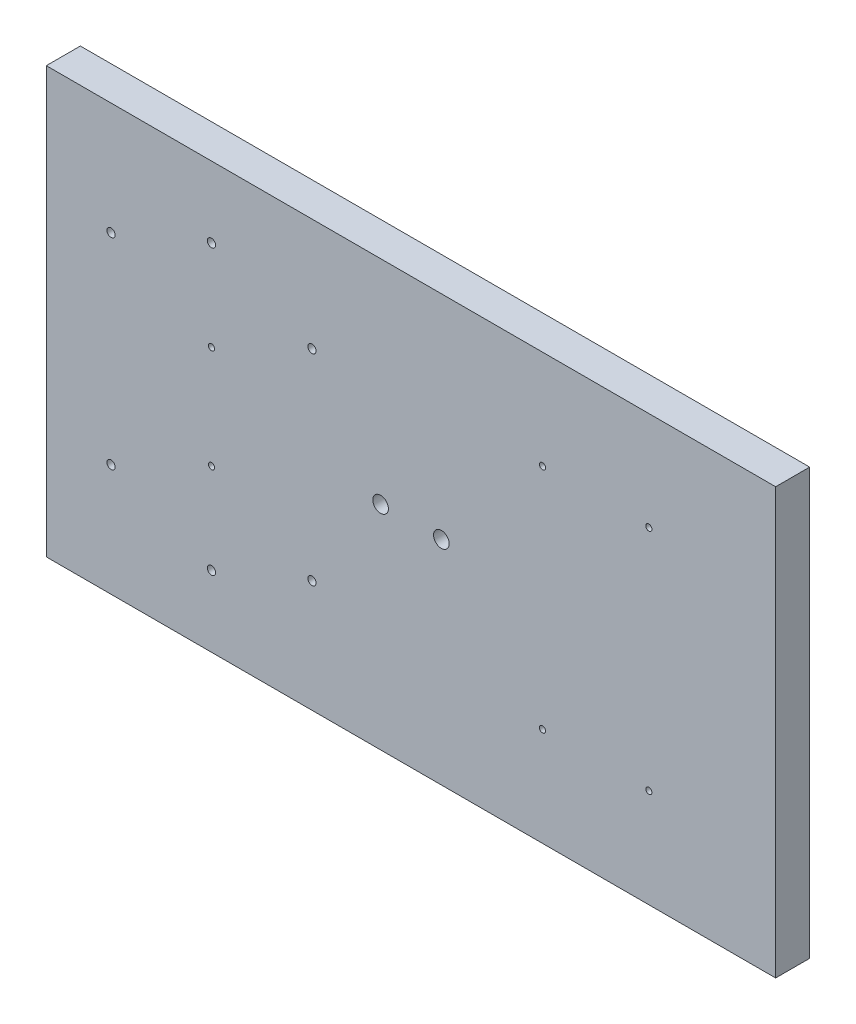
ISO-10303-21;
HEADER;
FILE_DESCRIPTION(('STEP AP214'),'2;1');
FILE_NAME('part.step','',(''),(''),'','','');
FILE_SCHEMA(('AUTOMOTIVE_DESIGN { 1 0 10303 214 1 1 1 1 }'));
ENDSEC;
DATA;
#1=APPLICATION_CONTEXT('core data for automotive mechanical design processes');
#2=APPLICATION_PROTOCOL_DEFINITION('international standard','automotive_design',2000,#1);
#3=PRODUCT_CONTEXT('',#1,'mechanical');
#4=PRODUCT('Part','Part','',(#3));
#5=PRODUCT_RELATED_PRODUCT_CATEGORY('part','',(#4));
#6=PRODUCT_DEFINITION_FORMATION('','',#4);
#7=PRODUCT_DEFINITION_CONTEXT('part definition',#1,'design');
#8=PRODUCT_DEFINITION('design','',#6,#7);
#9=PRODUCT_DEFINITION_SHAPE('','',#8);
#10=(LENGTH_UNIT() NAMED_UNIT(*) SI_UNIT(.MILLI.,.METRE.));
#11=(NAMED_UNIT(*) PLANE_ANGLE_UNIT() SI_UNIT($,.RADIAN.));
#12=(NAMED_UNIT(*) SI_UNIT($,.STERADIAN.) SOLID_ANGLE_UNIT());
#13=UNCERTAINTY_MEASURE_WITH_UNIT(LENGTH_MEASURE(1.E-05),#10,'distance_accuracy_value','');
#14=(GEOMETRIC_REPRESENTATION_CONTEXT(3) GLOBAL_UNCERTAINTY_ASSIGNED_CONTEXT((#13)) GLOBAL_UNIT_ASSIGNED_CONTEXT((#10,
#11,#12)) REPRESENTATION_CONTEXT('',''));
#15=CARTESIAN_POINT('',(0.,0.,0.));
#16=DIRECTION('',(0.,0.,1.));
#17=DIRECTION('',(1.,0.,0.));
#18=AXIS2_PLACEMENT_3D('',#15,#16,#17);
#19=CARTESIAN_POINT('',(152.4,-88.9,14.224));
#20=DIRECTION('',(-1.,0.,0.));
#21=DIRECTION('',(0.,0.,1.));
#22=AXIS2_PLACEMENT_3D('',#19,#20,#21);
#23=PLANE('',#22);
#24=DIRECTION('',(0.,1.,0.));
#25=VECTOR('',#24,1.);
#26=CARTESIAN_POINT('',(152.4,-88.9,0.));
#27=LINE('',#26,#25);
#28=CARTESIAN_POINT('',(152.4,-88.9,0.));
#29=VERTEX_POINT('',#28);
#30=CARTESIAN_POINT('',(152.4,88.9,0.));
#31=VERTEX_POINT('',#30);
#32=EDGE_CURVE('E231',#29,#31,#27,.T.);
#33=ORIENTED_EDGE('',*,*,#32,.T.);
#34=DIRECTION('',(0.,0.,-1.));
#35=VECTOR('',#34,1.);
#36=CARTESIAN_POINT('',(152.4,88.9,14.224));
#37=LINE('',#36,#35);
#38=CARTESIAN_POINT('',(152.4,88.9,14.224));
#39=VERTEX_POINT('',#38);
#40=EDGE_CURVE('E11',#39,#31,#37,.T.);
#41=ORIENTED_EDGE('',*,*,#40,.F.);
#42=DIRECTION('',(0.,1.,0.));
#43=VECTOR('',#42,1.);
#44=CARTESIAN_POINT('',(152.4,-88.9,14.224));
#45=LINE('',#44,#43);
#46=CARTESIAN_POINT('',(152.4,-88.9,14.224));
#47=VERTEX_POINT('',#46);
#48=EDGE_CURVE('E232',#47,#39,#45,.T.);
#49=ORIENTED_EDGE('',*,*,#48,.F.);
#50=DIRECTION('',(0.,0.,-1.));
#51=VECTOR('',#50,1.);
#52=CARTESIAN_POINT('',(152.4,-88.9,14.224));
#53=LINE('',#52,#51);
#54=EDGE_CURVE('E242',#47,#29,#53,.T.);
#55=ORIENTED_EDGE('',*,*,#54,.T.);
#56=EDGE_LOOP('',(#33,#41,#49,#55));
#57=FACE_BOUND('',#56,.T.);
#58=ADVANCED_FACE('F39',(#57),#23,.F.);
#59=CARTESIAN_POINT('',(-152.4,88.9,14.224));
#60=DIRECTION('',(0.,-1.,0.));
#61=DIRECTION('',(0.,0.,-1.));
#62=AXIS2_PLACEMENT_3D('',#59,#60,#61);
#63=PLANE('',#62);
#64=DIRECTION('',(-1.,0.,0.));
#65=VECTOR('',#64,1.);
#66=CARTESIAN_POINT('',(-152.4,88.9,0.));
#67=LINE('',#66,#65);
#68=CARTESIAN_POINT('',(-152.4,88.9,0.));
#69=VERTEX_POINT('',#68);
#70=EDGE_CURVE('E246',#31,#69,#67,.T.);
#71=ORIENTED_EDGE('',*,*,#70,.T.);
#72=DIRECTION('',(0.,0.,-1.));
#73=VECTOR('',#72,1.);
#74=CARTESIAN_POINT('',(-152.4,88.9,14.224));
#75=LINE('',#74,#73);
#76=CARTESIAN_POINT('',(-152.4,88.9,14.224));
#77=VERTEX_POINT('',#76);
#78=EDGE_CURVE('E48',#77,#69,#75,.T.);
#79=ORIENTED_EDGE('',*,*,#78,.F.);
#80=DIRECTION('',(-1.,0.,0.));
#81=VECTOR('',#80,1.);
#82=CARTESIAN_POINT('',(-152.4,88.9,14.224));
#83=LINE('',#82,#81);
#84=EDGE_CURVE('E87',#39,#77,#83,.T.);
#85=ORIENTED_EDGE('',*,*,#84,.F.);
#86=ORIENTED_EDGE('',*,*,#40,.T.);
#87=EDGE_LOOP('',(#71,#79,#85,#86));
#88=FACE_BOUND('',#87,.T.);
#89=ADVANCED_FACE('F276',(#88),#63,.F.);
#90=CARTESIAN_POINT('',(-152.4,-88.9,14.224));
#91=DIRECTION('',(1.,0.,0.));
#92=DIRECTION('',(0.,0.,-1.));
#93=AXIS2_PLACEMENT_3D('',#90,#91,#92);
#94=PLANE('',#93);
#95=DIRECTION('',(0.,-1.,0.));
#96=VECTOR('',#95,1.);
#97=CARTESIAN_POINT('',(-152.4,-88.9,0.));
#98=LINE('',#97,#96);
#99=CARTESIAN_POINT('',(-152.4,-88.9,0.));
#100=VERTEX_POINT('',#99);
#101=EDGE_CURVE('E74',#69,#100,#98,.T.);
#102=ORIENTED_EDGE('',*,*,#101,.T.);
#103=DIRECTION('',(0.,0.,-1.));
#104=VECTOR('',#103,1.);
#105=CARTESIAN_POINT('',(-152.4,-88.9,14.224));
#106=LINE('',#105,#104);
#107=CARTESIAN_POINT('',(-152.4,-88.9,14.224));
#108=VERTEX_POINT('',#107);
#109=EDGE_CURVE('E255',#108,#100,#106,.T.);
#110=ORIENTED_EDGE('',*,*,#109,.F.);
#111=DIRECTION('',(0.,-1.,0.));
#112=VECTOR('',#111,1.);
#113=CARTESIAN_POINT('',(-152.4,-88.9,14.224));
#114=LINE('',#113,#112);
#115=EDGE_CURVE('E237',#77,#108,#114,.T.);
#116=ORIENTED_EDGE('',*,*,#115,.F.);
#117=ORIENTED_EDGE('',*,*,#78,.T.);
#118=EDGE_LOOP('',(#102,#110,#116,#117));
#119=FACE_BOUND('',#118,.T.);
#120=ADVANCED_FACE('F259',(#119),#94,.F.);
#121=CARTESIAN_POINT('',(-152.4,-88.9,14.224));
#122=DIRECTION('',(0.,1.,0.));
#123=DIRECTION('',(0.,0.,1.));
#124=AXIS2_PLACEMENT_3D('',#121,#122,#123);
#125=PLANE('',#124);
#126=DIRECTION('',(1.,0.,0.));
#127=VECTOR('',#126,1.);
#128=CARTESIAN_POINT('',(-152.4,-88.9,0.));
#129=LINE('',#128,#127);
#130=EDGE_CURVE('E80',#100,#29,#129,.T.);
#131=ORIENTED_EDGE('',*,*,#130,.T.);
#132=ORIENTED_EDGE('',*,*,#54,.F.);
#133=DIRECTION('',(1.,0.,0.));
#134=VECTOR('',#133,1.);
#135=CARTESIAN_POINT('',(-152.4,-88.9,14.224));
#136=LINE('',#135,#134);
#137=EDGE_CURVE('E56',#108,#47,#136,.T.);
#138=ORIENTED_EDGE('',*,*,#137,.F.);
#139=ORIENTED_EDGE('',*,*,#109,.T.);
#140=EDGE_LOOP('',(#131,#132,#138,#139));
#141=FACE_BOUND('',#140,.T.);
#142=ADVANCED_FACE('F266',(#141),#125,.F.);
#143=CARTESIAN_POINT('',(0.,0.,14.224));
#144=DIRECTION('',(0.,0.,-1.));
#145=DIRECTION('',(-1.,0.,0.));
#146=AXIS2_PLACEMENT_3D('',#143,#144,#145);
#147=PLANE('',#146);
#148=CARTESIAN_POINT('',(12.7000000000001,0.,14.224));
#149=DIRECTION('',(0.,0.,-1.));
#150=DIRECTION('',(-1.,0.,0.));
#151=AXIS2_PLACEMENT_3D('',#148,#149,#150);
#152=CIRCLE('',#151,3.2639);
#153=CARTESIAN_POINT('',(9.43610000000008,0.,14.224));
#154=VERTEX_POINT('',#153);
#155=EDGE_CURVE('E567',#154,#154,#152,.T.);
#156=ORIENTED_EDGE('',*,*,#155,.T.);
#157=EDGE_LOOP('',(#156));
#158=FACE_BOUND('',#157,.T.);
#159=CARTESIAN_POINT('',(-12.6999999999999,0.,14.224));
#160=DIRECTION('',(0.,0.,-1.));
#161=DIRECTION('',(-1.,0.,0.));
#162=AXIS2_PLACEMENT_3D('',#159,#160,#161);
#163=CIRCLE('',#162,3.2639);
#164=CARTESIAN_POINT('',(-15.9638999999999,0.,14.224));
#165=VERTEX_POINT('',#164);
#166=EDGE_CURVE('E144',#165,#165,#163,.T.);
#167=ORIENTED_EDGE('',*,*,#166,.T.);
#168=EDGE_LOOP('',(#167));
#169=FACE_BOUND('',#168,.T.);
#170=CARTESIAN_POINT('',(-83.375,21.5,14.224));
#171=DIRECTION('',(0.,0.,1.));
#172=DIRECTION('',(1.,0.,0.));
#173=AXIS2_PLACEMENT_3D('',#170,#171,#172);
#174=CIRCLE('',#173,1.28905);
#175=CARTESIAN_POINT('',(-82.08595,21.5,14.224));
#176=VERTEX_POINT('',#175);
#177=EDGE_CURVE('E136',#176,#176,#174,.T.);
#178=ORIENTED_EDGE('',*,*,#177,.F.);
#179=EDGE_LOOP('',(#178));
#180=FACE_BOUND('',#179,.T.);
#181=CARTESIAN_POINT('',(-83.375,-21.5,14.224));
#182=DIRECTION('',(0.,0.,1.));
#183=DIRECTION('',(1.,0.,0.));
#184=AXIS2_PLACEMENT_3D('',#181,#182,#183);
#185=CIRCLE('',#184,1.28905);
#186=CARTESIAN_POINT('',(-82.08595,-21.5,14.224));
#187=VERTEX_POINT('',#186);
#188=EDGE_CURVE('E135',#187,#187,#185,.T.);
#189=ORIENTED_EDGE('',*,*,#188,.F.);
#190=EDGE_LOOP('',(#189));
#191=FACE_BOUND('',#190,.T.);
#192=CARTESIAN_POINT('',(54.9507193906911,47.625,14.224));
#193=DIRECTION('',(0.,0.,1.));
#194=DIRECTION('',(1.,0.,0.));
#195=AXIS2_PLACEMENT_3D('',#192,#193,#194);
#196=CIRCLE('',#195,1.28905);
#197=CARTESIAN_POINT('',(56.2397693906911,47.625,14.224));
#198=VERTEX_POINT('',#197);
#199=EDGE_CURVE('E151',#198,#198,#196,.T.);
#200=ORIENTED_EDGE('',*,*,#199,.F.);
#201=EDGE_LOOP('',(#200));
#202=FACE_BOUND('',#201,.T.);
#203=CARTESIAN_POINT('',(99.4007193906911,47.625,14.224));
#204=DIRECTION('',(0.,0.,1.));
#205=DIRECTION('',(1.,0.,0.));
#206=AXIS2_PLACEMENT_3D('',#203,#204,#205);
#207=CIRCLE('',#206,1.28905);
#208=CARTESIAN_POINT('',(100.689769390691,47.625,14.224));
#209=VERTEX_POINT('',#208);
#210=EDGE_CURVE('E159',#209,#209,#207,.T.);
#211=ORIENTED_EDGE('',*,*,#210,.F.);
#212=EDGE_LOOP('',(#211));
#213=FACE_BOUND('',#212,.T.);
#214=CARTESIAN_POINT('',(99.4007193906911,-47.625,14.224));
#215=DIRECTION('',(0.,0.,1.));
#216=DIRECTION('',(1.,0.,0.));
#217=AXIS2_PLACEMENT_3D('',#214,#215,#216);
#218=CIRCLE('',#217,1.28905);
#219=CARTESIAN_POINT('',(100.689769390691,-47.625,14.224));
#220=VERTEX_POINT('',#219);
#221=EDGE_CURVE('E167',#220,#220,#218,.T.);
#222=ORIENTED_EDGE('',*,*,#221,.F.);
#223=EDGE_LOOP('',(#222));
#224=FACE_BOUND('',#223,.T.);
#225=CARTESIAN_POINT('',(54.9507193906911,-47.625,14.224));
#226=DIRECTION('',(0.,0.,1.));
#227=DIRECTION('',(1.,0.,0.));
#228=AXIS2_PLACEMENT_3D('',#225,#226,#227);
#229=CIRCLE('',#228,1.28905);
#230=CARTESIAN_POINT('',(56.2397693906911,-47.625,14.224));
#231=VERTEX_POINT('',#230);
#232=EDGE_CURVE('E175',#231,#231,#229,.T.);
#233=ORIENTED_EDGE('',*,*,#232,.F.);
#234=EDGE_LOOP('',(#233));
#235=FACE_BOUND('',#234,.T.);
#236=CARTESIAN_POINT('',(-41.39,41.985,14.224));
#237=DIRECTION('',(0.,0.,1.));
#238=DIRECTION('',(1.,0.,0.));
#239=AXIS2_PLACEMENT_3D('',#236,#237,#238);
#240=CIRCLE('',#239,1.72719999999999);
#241=CARTESIAN_POINT('',(-39.6628,41.985,14.224));
#242=VERTEX_POINT('',#241);
#243=EDGE_CURVE('E183',#242,#242,#240,.T.);
#244=ORIENTED_EDGE('',*,*,#243,.F.);
#245=EDGE_LOOP('',(#244));
#246=FACE_BOUND('',#245,.T.);
#247=CARTESIAN_POINT('',(-41.39,-41.985,14.224));
#248=DIRECTION('',(0.,0.,1.));
#249=DIRECTION('',(1.,0.,0.));
#250=AXIS2_PLACEMENT_3D('',#247,#248,#249);
#251=CIRCLE('',#250,1.72719999999999);
#252=CARTESIAN_POINT('',(-39.6628,-41.985,14.224));
#253=VERTEX_POINT('',#252);
#254=EDGE_CURVE('E191',#253,#253,#251,.T.);
#255=ORIENTED_EDGE('',*,*,#254,.F.);
#256=EDGE_LOOP('',(#255));
#257=FACE_BOUND('',#256,.T.);
#258=CARTESIAN_POINT('',(-125.36,-41.985,14.224));
#259=DIRECTION('',(0.,0.,1.));
#260=DIRECTION('',(1.,0.,0.));
#261=AXIS2_PLACEMENT_3D('',#258,#259,#260);
#262=CIRCLE('',#261,1.72719999999998);
#263=CARTESIAN_POINT('',(-123.6328,-41.985,14.224));
#264=VERTEX_POINT('',#263);
#265=EDGE_CURVE('E199',#264,#264,#262,.T.);
#266=ORIENTED_EDGE('',*,*,#265,.F.);
#267=EDGE_LOOP('',(#266));
#268=FACE_BOUND('',#267,.T.);
#269=CARTESIAN_POINT('',(-125.36,41.985,14.224));
#270=DIRECTION('',(0.,0.,1.));
#271=DIRECTION('',(1.,0.,0.));
#272=AXIS2_PLACEMENT_3D('',#269,#270,#271);
#273=CIRCLE('',#272,1.72719999999998);
#274=CARTESIAN_POINT('',(-123.6328,41.985,14.224));
#275=VERTEX_POINT('',#274);
#276=EDGE_CURVE('E207',#275,#275,#273,.T.);
#277=ORIENTED_EDGE('',*,*,#276,.F.);
#278=EDGE_LOOP('',(#277));
#279=FACE_BOUND('',#278,.T.);
#280=CARTESIAN_POINT('',(-83.375,59.2455,14.224));
#281=DIRECTION('',(0.,0.,1.));
#282=DIRECTION('',(1.,0.,0.));
#283=AXIS2_PLACEMENT_3D('',#280,#281,#282);
#284=CIRCLE('',#283,1.72719999999998);
#285=CARTESIAN_POINT('',(-81.6478,59.2455,14.224));
#286=VERTEX_POINT('',#285);
#287=EDGE_CURVE('E215',#286,#286,#284,.T.);
#288=ORIENTED_EDGE('',*,*,#287,.F.);
#289=EDGE_LOOP('',(#288));
#290=FACE_BOUND('',#289,.T.);
#291=CARTESIAN_POINT('',(-83.3750000000001,-59.2455,14.224));
#292=DIRECTION('',(0.,0.,1.));
#293=DIRECTION('',(1.,0.,0.));
#294=AXIS2_PLACEMENT_3D('',#291,#292,#293);
#295=CIRCLE('',#294,1.72719999999998);
#296=CARTESIAN_POINT('',(-81.6478000000001,-59.2455,14.224));
#297=VERTEX_POINT('',#296);
#298=EDGE_CURVE('E223',#297,#297,#295,.T.);
#299=ORIENTED_EDGE('',*,*,#298,.F.);
#300=EDGE_LOOP('',(#299));
#301=FACE_BOUND('',#300,.T.);
#302=ORIENTED_EDGE('',*,*,#48,.T.);
#303=ORIENTED_EDGE('',*,*,#84,.T.);
#304=ORIENTED_EDGE('',*,*,#115,.T.);
#305=ORIENTED_EDGE('',*,*,#137,.T.);
#306=EDGE_LOOP('',(#302,#303,#304,#305));
#307=FACE_BOUND('',#306,.T.);
#308=ADVANCED_FACE('F268',(#158,#169,#180,#191,#202,#213,#224,#235,#246,#257,#268,#279,#290,
#301,#307),#147,.F.);
#309=CARTESIAN_POINT('',(0.,0.,0.));
#310=DIRECTION('',(0.,0.,-1.));
#311=DIRECTION('',(-1.,0.,0.));
#312=AXIS2_PLACEMENT_3D('',#309,#310,#311);
#313=PLANE('',#312);
#314=CARTESIAN_POINT('',(12.7000000000001,0.,0.));
#315=DIRECTION('',(0.,0.,-1.));
#316=DIRECTION('',(-1.,0.,0.));
#317=AXIS2_PLACEMENT_3D('',#314,#315,#316);
#318=CIRCLE('',#317,3.2639);
#319=CARTESIAN_POINT('',(9.43610000000008,0.,0.));
#320=VERTEX_POINT('',#319);
#321=EDGE_CURVE('E570',#320,#320,#318,.T.);
#322=ORIENTED_EDGE('',*,*,#321,.F.);
#323=EDGE_LOOP('',(#322));
#324=FACE_BOUND('',#323,.T.);
#325=CARTESIAN_POINT('',(-12.6999999999999,0.,0.));
#326=DIRECTION('',(0.,0.,-1.));
#327=DIRECTION('',(-1.,0.,0.));
#328=AXIS2_PLACEMENT_3D('',#325,#326,#327);
#329=CIRCLE('',#328,3.2639);
#330=CARTESIAN_POINT('',(-15.9638999999999,0.,0.));
#331=VERTEX_POINT('',#330);
#332=EDGE_CURVE('E574',#331,#331,#329,.T.);
#333=ORIENTED_EDGE('',*,*,#332,.F.);
#334=EDGE_LOOP('',(#333));
#335=FACE_BOUND('',#334,.T.);
#336=ORIENTED_EDGE('',*,*,#32,.F.);
#337=ORIENTED_EDGE('',*,*,#130,.F.);
#338=ORIENTED_EDGE('',*,*,#101,.F.);
#339=ORIENTED_EDGE('',*,*,#70,.F.);
#340=EDGE_LOOP('',(#336,#337,#338,#339));
#341=FACE_BOUND('',#340,.T.);
#342=ADVANCED_FACE('F262',(#324,#335,#341),#313,.T.);
#343=CARTESIAN_POINT('',(-83.3750000000001,-59.2455,6.35));
#344=DIRECTION('',(0.,0.,1.));
#345=DIRECTION('',(1.,0.,0.));
#346=AXIS2_PLACEMENT_3D('',#343,#344,#345);
#347=CONICAL_SURFACE('',#346,1.7272,1.02974425867665);
#348=CARTESIAN_POINT('',(-83.3750000000001,-59.2455,5.3121935388156));
#349=VERTEX_POINT('',#348);
#350=VERTEX_LOOP('',#349);
#351=FACE_BOUND('',#350,.T.);
#352=CARTESIAN_POINT('',(-83.3750000000001,-59.2455,6.35));
#353=DIRECTION('',(0.,0.,1.));
#354=DIRECTION('',(1.,0.,0.));
#355=AXIS2_PLACEMENT_3D('',#352,#353,#354);
#356=CIRCLE('',#355,1.7272);
#357=CARTESIAN_POINT('',(-81.6478000000001,-59.2455,6.35));
#358=VERTEX_POINT('',#357);
#359=EDGE_CURVE('E227',#358,#358,#356,.T.);
#360=ORIENTED_EDGE('',*,*,#359,.T.);
#361=EDGE_LOOP('',(#360));
#362=FACE_BOUND('',#361,.T.);
#363=ADVANCED_FACE('F299',(#351,#362),#347,.F.);
#364=CARTESIAN_POINT('',(-83.3750000000001,-59.2455,14.224));
#365=DIRECTION('',(0.,0.,1.));
#366=DIRECTION('',(1.,0.,0.));
#367=AXIS2_PLACEMENT_3D('',#364,#365,#366);
#368=CYLINDRICAL_SURFACE('',#367,1.72719999999999);
#369=ORIENTED_EDGE('',*,*,#359,.F.);
#370=EDGE_LOOP('',(#369));
#371=FACE_BOUND('',#370,.T.);
#372=ORIENTED_EDGE('',*,*,#298,.T.);
#373=EDGE_LOOP('',(#372));
#374=FACE_BOUND('',#373,.T.);
#375=ADVANCED_FACE('F304',(#371,#374),#368,.F.);
#376=CARTESIAN_POINT('',(-83.375,59.2455,6.35));
#377=DIRECTION('',(0.,0.,1.));
#378=DIRECTION('',(1.,0.,0.));
#379=AXIS2_PLACEMENT_3D('',#376,#377,#378);
#380=CONICAL_SURFACE('',#379,1.7272,1.02974425867665);
#381=CARTESIAN_POINT('',(-83.375,59.2455,5.3121935388156));
#382=VERTEX_POINT('',#381);
#383=VERTEX_LOOP('',#382);
#384=FACE_BOUND('',#383,.T.);
#385=CARTESIAN_POINT('',(-83.375,59.2455,6.35));
#386=DIRECTION('',(0.,0.,1.));
#387=DIRECTION('',(1.,0.,0.));
#388=AXIS2_PLACEMENT_3D('',#385,#386,#387);
#389=CIRCLE('',#388,1.7272);
#390=CARTESIAN_POINT('',(-81.6478,59.2455,6.35));
#391=VERTEX_POINT('',#390);
#392=EDGE_CURVE('E219',#391,#391,#389,.T.);
#393=ORIENTED_EDGE('',*,*,#392,.T.);
#394=EDGE_LOOP('',(#393));
#395=FACE_BOUND('',#394,.T.);
#396=ADVANCED_FACE('F316',(#384,#395),#380,.F.);
#397=CARTESIAN_POINT('',(-83.375,59.2455,14.224));
#398=DIRECTION('',(0.,0.,1.));
#399=DIRECTION('',(1.,0.,0.));
#400=AXIS2_PLACEMENT_3D('',#397,#398,#399);
#401=CYLINDRICAL_SURFACE('',#400,1.72719999999999);
#402=ORIENTED_EDGE('',*,*,#392,.F.);
#403=EDGE_LOOP('',(#402));
#404=FACE_BOUND('',#403,.T.);
#405=ORIENTED_EDGE('',*,*,#287,.T.);
#406=EDGE_LOOP('',(#405));
#407=FACE_BOUND('',#406,.T.);
#408=ADVANCED_FACE('F326',(#404,#407),#401,.F.);
#409=CARTESIAN_POINT('',(-125.36,41.985,6.35));
#410=DIRECTION('',(0.,0.,1.));
#411=DIRECTION('',(1.,0.,0.));
#412=AXIS2_PLACEMENT_3D('',#409,#410,#411);
#413=CONICAL_SURFACE('',#412,1.7272,1.02974425867665);
#414=CARTESIAN_POINT('',(-125.36,41.985,5.3121935388156));
#415=VERTEX_POINT('',#414);
#416=VERTEX_LOOP('',#415);
#417=FACE_BOUND('',#416,.T.);
#418=CARTESIAN_POINT('',(-125.36,41.985,6.35));
#419=DIRECTION('',(0.,0.,1.));
#420=DIRECTION('',(1.,0.,0.));
#421=AXIS2_PLACEMENT_3D('',#418,#419,#420);
#422=CIRCLE('',#421,1.7272);
#423=CARTESIAN_POINT('',(-123.6328,41.985,6.35));
#424=VERTEX_POINT('',#423);
#425=EDGE_CURVE('E211',#424,#424,#422,.T.);
#426=ORIENTED_EDGE('',*,*,#425,.T.);
#427=EDGE_LOOP('',(#426));
#428=FACE_BOUND('',#427,.T.);
#429=ADVANCED_FACE('F336',(#417,#428),#413,.F.);
#430=CARTESIAN_POINT('',(-125.36,41.985,14.224));
#431=DIRECTION('',(0.,0.,1.));
#432=DIRECTION('',(1.,0.,0.));
#433=AXIS2_PLACEMENT_3D('',#430,#431,#432);
#434=CYLINDRICAL_SURFACE('',#433,1.72719999999999);
#435=ORIENTED_EDGE('',*,*,#425,.F.);
#436=EDGE_LOOP('',(#435));
#437=FACE_BOUND('',#436,.T.);
#438=ORIENTED_EDGE('',*,*,#276,.T.);
#439=EDGE_LOOP('',(#438));
#440=FACE_BOUND('',#439,.T.);
#441=ADVANCED_FACE('F346',(#437,#440),#434,.F.);
#442=CARTESIAN_POINT('',(-125.36,-41.985,6.35));
#443=DIRECTION('',(0.,0.,1.));
#444=DIRECTION('',(1.,0.,0.));
#445=AXIS2_PLACEMENT_3D('',#442,#443,#444);
#446=CONICAL_SURFACE('',#445,1.7272,1.02974425867665);
#447=CARTESIAN_POINT('',(-125.36,-41.985,5.3121935388156));
#448=VERTEX_POINT('',#447);
#449=VERTEX_LOOP('',#448);
#450=FACE_BOUND('',#449,.T.);
#451=CARTESIAN_POINT('',(-125.36,-41.985,6.35));
#452=DIRECTION('',(0.,0.,1.));
#453=DIRECTION('',(1.,0.,0.));
#454=AXIS2_PLACEMENT_3D('',#451,#452,#453);
#455=CIRCLE('',#454,1.7272);
#456=CARTESIAN_POINT('',(-123.6328,-41.985,6.35));
#457=VERTEX_POINT('',#456);
#458=EDGE_CURVE('E203',#457,#457,#455,.T.);
#459=ORIENTED_EDGE('',*,*,#458,.T.);
#460=EDGE_LOOP('',(#459));
#461=FACE_BOUND('',#460,.T.);
#462=ADVANCED_FACE('F356',(#450,#461),#446,.F.);
#463=CARTESIAN_POINT('',(-125.36,-41.985,14.224));
#464=DIRECTION('',(0.,0.,1.));
#465=DIRECTION('',(1.,0.,0.));
#466=AXIS2_PLACEMENT_3D('',#463,#464,#465);
#467=CYLINDRICAL_SURFACE('',#466,1.72719999999999);
#468=ORIENTED_EDGE('',*,*,#458,.F.);
#469=EDGE_LOOP('',(#468));
#470=FACE_BOUND('',#469,.T.);
#471=ORIENTED_EDGE('',*,*,#265,.T.);
#472=EDGE_LOOP('',(#471));
#473=FACE_BOUND('',#472,.T.);
#474=ADVANCED_FACE('F366',(#470,#473),#467,.F.);
#475=CARTESIAN_POINT('',(-41.39,-41.985,6.35));
#476=DIRECTION('',(0.,0.,1.));
#477=DIRECTION('',(1.,0.,0.));
#478=AXIS2_PLACEMENT_3D('',#475,#476,#477);
#479=CONICAL_SURFACE('',#478,1.7272,1.02974425867665);
#480=CARTESIAN_POINT('',(-41.39,-41.985,5.3121935388156));
#481=VERTEX_POINT('',#480);
#482=VERTEX_LOOP('',#481);
#483=FACE_BOUND('',#482,.T.);
#484=CARTESIAN_POINT('',(-41.39,-41.985,6.35));
#485=DIRECTION('',(0.,0.,1.));
#486=DIRECTION('',(1.,0.,0.));
#487=AXIS2_PLACEMENT_3D('',#484,#485,#486);
#488=CIRCLE('',#487,1.7272);
#489=CARTESIAN_POINT('',(-39.6628,-41.985,6.35));
#490=VERTEX_POINT('',#489);
#491=EDGE_CURVE('E195',#490,#490,#488,.T.);
#492=ORIENTED_EDGE('',*,*,#491,.T.);
#493=EDGE_LOOP('',(#492));
#494=FACE_BOUND('',#493,.T.);
#495=ADVANCED_FACE('F376',(#483,#494),#479,.F.);
#496=CARTESIAN_POINT('',(-41.39,-41.985,14.224));
#497=DIRECTION('',(0.,0.,1.));
#498=DIRECTION('',(1.,0.,0.));
#499=AXIS2_PLACEMENT_3D('',#496,#497,#498);
#500=CYLINDRICAL_SURFACE('',#499,1.72719999999999);
#501=ORIENTED_EDGE('',*,*,#491,.F.);
#502=EDGE_LOOP('',(#501));
#503=FACE_BOUND('',#502,.T.);
#504=ORIENTED_EDGE('',*,*,#254,.T.);
#505=EDGE_LOOP('',(#504));
#506=FACE_BOUND('',#505,.T.);
#507=ADVANCED_FACE('F386',(#503,#506),#500,.F.);
#508=CARTESIAN_POINT('',(-41.39,41.985,6.35));
#509=DIRECTION('',(0.,0.,1.));
#510=DIRECTION('',(1.,0.,0.));
#511=AXIS2_PLACEMENT_3D('',#508,#509,#510);
#512=CONICAL_SURFACE('',#511,1.7272,1.02974425867665);
#513=CARTESIAN_POINT('',(-41.39,41.985,5.3121935388156));
#514=VERTEX_POINT('',#513);
#515=VERTEX_LOOP('',#514);
#516=FACE_BOUND('',#515,.T.);
#517=CARTESIAN_POINT('',(-41.39,41.985,6.35));
#518=DIRECTION('',(0.,0.,1.));
#519=DIRECTION('',(1.,0.,0.));
#520=AXIS2_PLACEMENT_3D('',#517,#518,#519);
#521=CIRCLE('',#520,1.7272);
#522=CARTESIAN_POINT('',(-39.6628,41.985,6.35));
#523=VERTEX_POINT('',#522);
#524=EDGE_CURVE('E187',#523,#523,#521,.T.);
#525=ORIENTED_EDGE('',*,*,#524,.T.);
#526=EDGE_LOOP('',(#525));
#527=FACE_BOUND('',#526,.T.);
#528=ADVANCED_FACE('F396',(#516,#527),#512,.F.);
#529=CARTESIAN_POINT('',(-41.39,41.985,14.224));
#530=DIRECTION('',(0.,0.,1.));
#531=DIRECTION('',(1.,0.,0.));
#532=AXIS2_PLACEMENT_3D('',#529,#530,#531);
#533=CYLINDRICAL_SURFACE('',#532,1.72719999999999);
#534=ORIENTED_EDGE('',*,*,#524,.F.);
#535=EDGE_LOOP('',(#534));
#536=FACE_BOUND('',#535,.T.);
#537=ORIENTED_EDGE('',*,*,#243,.T.);
#538=EDGE_LOOP('',(#537));
#539=FACE_BOUND('',#538,.T.);
#540=ADVANCED_FACE('F406',(#536,#539),#533,.F.);
#541=CARTESIAN_POINT('',(54.9507193906911,-47.625,6.35));
#542=DIRECTION('',(0.,0.,1.));
#543=DIRECTION('',(1.,0.,0.));
#544=AXIS2_PLACEMENT_3D('',#541,#542,#543);
#545=CONICAL_SURFACE('',#544,1.28905,1.02974425867665);
#546=CARTESIAN_POINT('',(54.9507193906911,-47.625,5.57546061904252));
#547=VERTEX_POINT('',#546);
#548=VERTEX_LOOP('',#547);
#549=FACE_BOUND('',#548,.T.);
#550=CARTESIAN_POINT('',(54.9507193906911,-47.625,6.35));
#551=DIRECTION('',(0.,0.,1.));
#552=DIRECTION('',(1.,0.,0.));
#553=AXIS2_PLACEMENT_3D('',#550,#551,#552);
#554=CIRCLE('',#553,1.28905);
#555=CARTESIAN_POINT('',(56.2397693906911,-47.625,6.35));
#556=VERTEX_POINT('',#555);
#557=EDGE_CURVE('E179',#556,#556,#554,.T.);
#558=ORIENTED_EDGE('',*,*,#557,.T.);
#559=EDGE_LOOP('',(#558));
#560=FACE_BOUND('',#559,.T.);
#561=ADVANCED_FACE('F416',(#549,#560),#545,.F.);
#562=CARTESIAN_POINT('',(54.9507193906911,-47.625,14.224));
#563=DIRECTION('',(0.,0.,1.));
#564=DIRECTION('',(1.,0.,0.));
#565=AXIS2_PLACEMENT_3D('',#562,#563,#564);
#566=CYLINDRICAL_SURFACE('',#565,1.28905);
#567=ORIENTED_EDGE('',*,*,#557,.F.);
#568=EDGE_LOOP('',(#567));
#569=FACE_BOUND('',#568,.T.);
#570=ORIENTED_EDGE('',*,*,#232,.T.);
#571=EDGE_LOOP('',(#570));
#572=FACE_BOUND('',#571,.T.);
#573=ADVANCED_FACE('F426',(#569,#572),#566,.F.);
#574=CARTESIAN_POINT('',(99.4007193906911,-47.625,6.35));
#575=DIRECTION('',(0.,0.,1.));
#576=DIRECTION('',(1.,0.,0.));
#577=AXIS2_PLACEMENT_3D('',#574,#575,#576);
#578=CONICAL_SURFACE('',#577,1.28905,1.02974425867665);
#579=CARTESIAN_POINT('',(99.4007193906911,-47.625,5.57546061904252));
#580=VERTEX_POINT('',#579);
#581=VERTEX_LOOP('',#580);
#582=FACE_BOUND('',#581,.T.);
#583=CARTESIAN_POINT('',(99.4007193906911,-47.625,6.35));
#584=DIRECTION('',(0.,0.,1.));
#585=DIRECTION('',(1.,0.,0.));
#586=AXIS2_PLACEMENT_3D('',#583,#584,#585);
#587=CIRCLE('',#586,1.28905);
#588=CARTESIAN_POINT('',(100.689769390691,-47.625,6.35));
#589=VERTEX_POINT('',#588);
#590=EDGE_CURVE('E171',#589,#589,#587,.T.);
#591=ORIENTED_EDGE('',*,*,#590,.T.);
#592=EDGE_LOOP('',(#591));
#593=FACE_BOUND('',#592,.T.);
#594=ADVANCED_FACE('F436',(#582,#593),#578,.F.);
#595=CARTESIAN_POINT('',(99.4007193906911,-47.625,14.224));
#596=DIRECTION('',(0.,0.,1.));
#597=DIRECTION('',(1.,0.,0.));
#598=AXIS2_PLACEMENT_3D('',#595,#596,#597);
#599=CYLINDRICAL_SURFACE('',#598,1.28905);
#600=ORIENTED_EDGE('',*,*,#590,.F.);
#601=EDGE_LOOP('',(#600));
#602=FACE_BOUND('',#601,.T.);
#603=ORIENTED_EDGE('',*,*,#221,.T.);
#604=EDGE_LOOP('',(#603));
#605=FACE_BOUND('',#604,.T.);
#606=ADVANCED_FACE('F446',(#602,#605),#599,.F.);
#607=CARTESIAN_POINT('',(99.4007193906911,47.625,6.35));
#608=DIRECTION('',(0.,0.,1.));
#609=DIRECTION('',(1.,0.,0.));
#610=AXIS2_PLACEMENT_3D('',#607,#608,#609);
#611=CONICAL_SURFACE('',#610,1.28905,1.02974425867665);
#612=CARTESIAN_POINT('',(99.4007193906911,47.625,5.57546061904252));
#613=VERTEX_POINT('',#612);
#614=VERTEX_LOOP('',#613);
#615=FACE_BOUND('',#614,.T.);
#616=CARTESIAN_POINT('',(99.4007193906911,47.625,6.35));
#617=DIRECTION('',(0.,0.,1.));
#618=DIRECTION('',(1.,0.,0.));
#619=AXIS2_PLACEMENT_3D('',#616,#617,#618);
#620=CIRCLE('',#619,1.28905);
#621=CARTESIAN_POINT('',(100.689769390691,47.625,6.35));
#622=VERTEX_POINT('',#621);
#623=EDGE_CURVE('E163',#622,#622,#620,.T.);
#624=ORIENTED_EDGE('',*,*,#623,.T.);
#625=EDGE_LOOP('',(#624));
#626=FACE_BOUND('',#625,.T.);
#627=ADVANCED_FACE('F456',(#615,#626),#611,.F.);
#628=CARTESIAN_POINT('',(99.4007193906911,47.625,14.224));
#629=DIRECTION('',(0.,0.,1.));
#630=DIRECTION('',(1.,0.,0.));
#631=AXIS2_PLACEMENT_3D('',#628,#629,#630);
#632=CYLINDRICAL_SURFACE('',#631,1.28905);
#633=ORIENTED_EDGE('',*,*,#623,.F.);
#634=EDGE_LOOP('',(#633));
#635=FACE_BOUND('',#634,.T.);
#636=ORIENTED_EDGE('',*,*,#210,.T.);
#637=EDGE_LOOP('',(#636));
#638=FACE_BOUND('',#637,.T.);
#639=ADVANCED_FACE('F466',(#635,#638),#632,.F.);
#640=CARTESIAN_POINT('',(54.9507193906911,47.625,6.35));
#641=DIRECTION('',(0.,0.,1.));
#642=DIRECTION('',(1.,0.,0.));
#643=AXIS2_PLACEMENT_3D('',#640,#641,#642);
#644=CONICAL_SURFACE('',#643,1.28905,1.02974425867665);
#645=CARTESIAN_POINT('',(54.9507193906911,47.625,5.57546061904252));
#646=VERTEX_POINT('',#645);
#647=VERTEX_LOOP('',#646);
#648=FACE_BOUND('',#647,.T.);
#649=CARTESIAN_POINT('',(54.9507193906911,47.625,6.35));
#650=DIRECTION('',(0.,0.,1.));
#651=DIRECTION('',(1.,0.,0.));
#652=AXIS2_PLACEMENT_3D('',#649,#650,#651);
#653=CIRCLE('',#652,1.28905);
#654=CARTESIAN_POINT('',(56.2397693906911,47.625,6.35));
#655=VERTEX_POINT('',#654);
#656=EDGE_CURVE('E155',#655,#655,#653,.T.);
#657=ORIENTED_EDGE('',*,*,#656,.T.);
#658=EDGE_LOOP('',(#657));
#659=FACE_BOUND('',#658,.T.);
#660=ADVANCED_FACE('F476',(#648,#659),#644,.F.);
#661=CARTESIAN_POINT('',(54.9507193906911,47.625,14.224));
#662=DIRECTION('',(0.,0.,1.));
#663=DIRECTION('',(1.,0.,0.));
#664=AXIS2_PLACEMENT_3D('',#661,#662,#663);
#665=CYLINDRICAL_SURFACE('',#664,1.28905);
#666=ORIENTED_EDGE('',*,*,#656,.F.);
#667=EDGE_LOOP('',(#666));
#668=FACE_BOUND('',#667,.T.);
#669=ORIENTED_EDGE('',*,*,#199,.T.);
#670=EDGE_LOOP('',(#669));
#671=FACE_BOUND('',#670,.T.);
#672=ADVANCED_FACE('F486',(#668,#671),#665,.F.);
#673=CARTESIAN_POINT('',(-83.375,-21.5,6.35));
#674=DIRECTION('',(0.,0.,1.));
#675=DIRECTION('',(1.,0.,0.));
#676=AXIS2_PLACEMENT_3D('',#673,#674,#675);
#677=CONICAL_SURFACE('',#676,1.28905,1.02974425867665);
#678=CARTESIAN_POINT('',(-83.375,-21.5,5.57546061904252));
#679=VERTEX_POINT('',#678);
#680=VERTEX_LOOP('',#679);
#681=FACE_BOUND('',#680,.T.);
#682=CARTESIAN_POINT('',(-83.375,-21.5,6.35));
#683=DIRECTION('',(0.,0.,1.));
#684=DIRECTION('',(1.,0.,0.));
#685=AXIS2_PLACEMENT_3D('',#682,#683,#684);
#686=CIRCLE('',#685,1.28905);
#687=CARTESIAN_POINT('',(-82.08595,-21.5,6.35));
#688=VERTEX_POINT('',#687);
#689=EDGE_CURVE('E141',#688,#688,#686,.T.);
#690=ORIENTED_EDGE('',*,*,#689,.T.);
#691=EDGE_LOOP('',(#690));
#692=FACE_BOUND('',#691,.T.);
#693=ADVANCED_FACE('F496',(#681,#692),#677,.F.);
#694=CARTESIAN_POINT('',(-83.375,-21.5,14.224));
#695=DIRECTION('',(0.,0.,1.));
#696=DIRECTION('',(1.,0.,0.));
#697=AXIS2_PLACEMENT_3D('',#694,#695,#696);
#698=CYLINDRICAL_SURFACE('',#697,1.28905);
#699=ORIENTED_EDGE('',*,*,#689,.F.);
#700=EDGE_LOOP('',(#699));
#701=FACE_BOUND('',#700,.T.);
#702=ORIENTED_EDGE('',*,*,#188,.T.);
#703=EDGE_LOOP('',(#702));
#704=FACE_BOUND('',#703,.T.);
#705=ADVANCED_FACE('F128',(#701,#704),#698,.F.);
#706=CARTESIAN_POINT('',(-83.375,21.5,6.35));
#707=DIRECTION('',(0.,0.,1.));
#708=DIRECTION('',(1.,0.,0.));
#709=AXIS2_PLACEMENT_3D('',#706,#707,#708);
#710=CONICAL_SURFACE('',#709,1.28905,1.02974425867665);
#711=CARTESIAN_POINT('',(-83.375,21.5,5.57546061904252));
#712=VERTEX_POINT('',#711);
#713=VERTEX_LOOP('',#712);
#714=FACE_BOUND('',#713,.T.);
#715=CARTESIAN_POINT('',(-83.375,21.5,6.35));
#716=DIRECTION('',(0.,0.,1.));
#717=DIRECTION('',(1.,0.,0.));
#718=AXIS2_PLACEMENT_3D('',#715,#716,#717);
#719=CIRCLE('',#718,1.28905);
#720=CARTESIAN_POINT('',(-82.08595,21.5,6.35));
#721=VERTEX_POINT('',#720);
#722=EDGE_CURVE('E132',#721,#721,#719,.T.);
#723=ORIENTED_EDGE('',*,*,#722,.T.);
#724=EDGE_LOOP('',(#723));
#725=FACE_BOUND('',#724,.T.);
#726=ADVANCED_FACE('F124',(#714,#725),#710,.F.);
#727=CARTESIAN_POINT('',(-83.375,21.5,14.224));
#728=DIRECTION('',(0.,0.,1.));
#729=DIRECTION('',(1.,0.,0.));
#730=AXIS2_PLACEMENT_3D('',#727,#728,#729);
#731=CYLINDRICAL_SURFACE('',#730,1.28905);
#732=ORIENTED_EDGE('',*,*,#722,.F.);
#733=EDGE_LOOP('',(#732));
#734=FACE_BOUND('',#733,.T.);
#735=ORIENTED_EDGE('',*,*,#177,.T.);
#736=EDGE_LOOP('',(#735));
#737=FACE_BOUND('',#736,.T.);
#738=ADVANCED_FACE('F127',(#734,#737),#731,.F.);
#739=CARTESIAN_POINT('',(-12.6999999999999,0.,0.));
#740=DIRECTION('',(0.,0.,-1.));
#741=DIRECTION('',(-1.,0.,0.));
#742=AXIS2_PLACEMENT_3D('',#739,#740,#741);
#743=CYLINDRICAL_SURFACE('',#742,3.2639);
#744=ORIENTED_EDGE('',*,*,#166,.F.);
#745=EDGE_LOOP('',(#744));
#746=FACE_BOUND('',#745,.T.);
#747=ORIENTED_EDGE('',*,*,#332,.T.);
#748=EDGE_LOOP('',(#747));
#749=FACE_BOUND('',#748,.T.);
#750=ADVANCED_FACE('F530',(#746,#749),#743,.F.);
#751=CARTESIAN_POINT('',(12.7000000000001,0.,0.));
#752=DIRECTION('',(0.,0.,-1.));
#753=DIRECTION('',(-1.,0.,0.));
#754=AXIS2_PLACEMENT_3D('',#751,#752,#753);
#755=CYLINDRICAL_SURFACE('',#754,3.2639);
#756=ORIENTED_EDGE('',*,*,#155,.F.);
#757=EDGE_LOOP('',(#756));
#758=FACE_BOUND('',#757,.T.);
#759=ORIENTED_EDGE('',*,*,#321,.T.);
#760=EDGE_LOOP('',(#759));
#761=FACE_BOUND('',#760,.T.);
#762=ADVANCED_FACE('F550',(#758,#761),#755,.F.);
#763=CLOSED_SHELL('',(#58,#89,#120,#142,#308,#342,#363,#375,#396,#408,#429,#441,#462,#474,#495,
#507,#528,#540,#561,#573,#594,#606,#627,#639,#660,#672,#693,#705,#726,#738,#750,#762));
#764=MANIFOLD_SOLID_BREP('B2',#763);
#765=ADVANCED_BREP_SHAPE_REPRESENTATION('',(#18,#764),#14);
#766=SHAPE_DEFINITION_REPRESENTATION(#9,#765);
ENDSEC;
END-ISO-10303-21;
